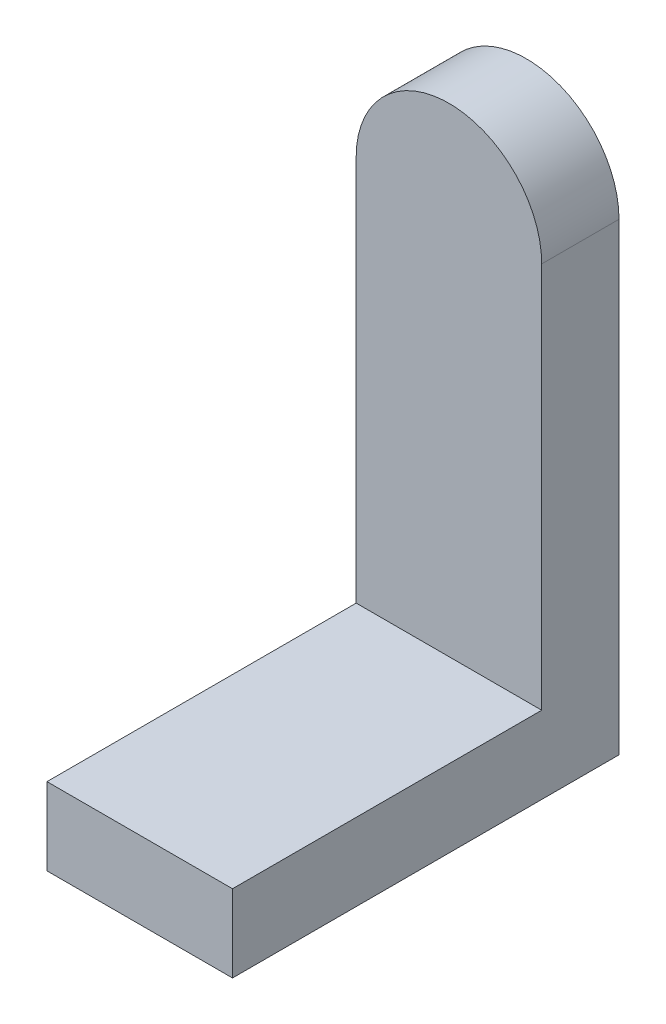
ISO-10303-21;
HEADER;
FILE_DESCRIPTION(('STEP AP214'),'2;1');
FILE_NAME('part.step','',(''),(''),'','','');
FILE_SCHEMA(('AUTOMOTIVE_DESIGN { 1 0 10303 214 1 1 1 1 }'));
ENDSEC;
DATA;
#1=APPLICATION_CONTEXT('core data for automotive mechanical design processes');
#2=APPLICATION_PROTOCOL_DEFINITION('international standard','automotive_design',2000,#1);
#3=PRODUCT_CONTEXT('',#1,'mechanical');
#4=PRODUCT('Part','Part','',(#3));
#5=PRODUCT_RELATED_PRODUCT_CATEGORY('part','',(#4));
#6=PRODUCT_DEFINITION_FORMATION('','',#4);
#7=PRODUCT_DEFINITION_CONTEXT('part definition',#1,'design');
#8=PRODUCT_DEFINITION('design','',#6,#7);
#9=PRODUCT_DEFINITION_SHAPE('','',#8);
#10=(LENGTH_UNIT() NAMED_UNIT(*) SI_UNIT(.MILLI.,.METRE.));
#11=(NAMED_UNIT(*) PLANE_ANGLE_UNIT() SI_UNIT($,.RADIAN.));
#12=(NAMED_UNIT(*) SI_UNIT($,.STERADIAN.) SOLID_ANGLE_UNIT());
#13=UNCERTAINTY_MEASURE_WITH_UNIT(LENGTH_MEASURE(1.E-05),#10,'distance_accuracy_value','');
#14=(GEOMETRIC_REPRESENTATION_CONTEXT(3) GLOBAL_UNCERTAINTY_ASSIGNED_CONTEXT((#13)) GLOBAL_UNIT_ASSIGNED_CONTEXT((#10,
#11,#12)) REPRESENTATION_CONTEXT('',''));
#15=CARTESIAN_POINT('',(0.,0.,0.));
#16=DIRECTION('',(0.,0.,1.));
#17=DIRECTION('',(1.,0.,0.));
#18=AXIS2_PLACEMENT_3D('',#15,#16,#17);
#19=CARTESIAN_POINT('',(0.,0.,5.));
#20=DIRECTION('',(0.,0.,1.));
#21=DIRECTION('',(1.,0.,0.));
#22=AXIS2_PLACEMENT_3D('',#19,#20,#21);
#23=PLANE('',#22);
#24=DIRECTION('',(0.,-1.,0.));
#25=VECTOR('',#24,1.);
#26=CARTESIAN_POINT('',(-6.,0.,5.));
#27=LINE('',#26,#25);
#28=CARTESIAN_POINT('',(-6.,15.,5.));
#29=VERTEX_POINT('',#28);
#30=CARTESIAN_POINT('',(-6.,-10.,5.));
#31=VERTEX_POINT('',#30);
#32=EDGE_CURVE('E97',#29,#31,#27,.T.);
#33=ORIENTED_EDGE('',*,*,#32,.T.);
#34=DIRECTION('',(1.,0.,0.));
#35=VECTOR('',#34,1.);
#36=CARTESIAN_POINT('',(-6.,-10.,5.));
#37=LINE('',#36,#35);
#38=CARTESIAN_POINT('',(6.,-10.,5.));
#39=VERTEX_POINT('',#38);
#40=EDGE_CURVE('E124',#31,#39,#37,.T.);
#41=ORIENTED_EDGE('',*,*,#40,.T.);
#42=DIRECTION('',(0.,-1.,0.));
#43=VECTOR('',#42,1.);
#44=CARTESIAN_POINT('',(6.,0.,5.));
#45=LINE('',#44,#43);
#46=CARTESIAN_POINT('',(6.,15.,5.));
#47=VERTEX_POINT('',#46);
#48=EDGE_CURVE('E81',#47,#39,#45,.T.);
#49=ORIENTED_EDGE('',*,*,#48,.F.);
#50=CARTESIAN_POINT('',(0.,15.,5.));
#51=DIRECTION('',(0.,0.,1.));
#52=DIRECTION('',(1.,0.,0.));
#53=AXIS2_PLACEMENT_3D('',#50,#51,#52);
#54=CIRCLE('',#53,6.);
#55=EDGE_CURVE('E78',#47,#29,#54,.T.);
#56=ORIENTED_EDGE('',*,*,#55,.T.);
#57=EDGE_LOOP('',(#33,#41,#49,#56));
#58=FACE_BOUND('',#57,.T.);
#59=ADVANCED_FACE('F32',(#58),#23,.T.);
#60=CARTESIAN_POINT('',(0.,15.,5.));
#61=DIRECTION('',(0.,0.,-1.));
#62=DIRECTION('',(-1.,0.,0.));
#63=AXIS2_PLACEMENT_3D('',#60,#61,#62);
#64=CYLINDRICAL_SURFACE('',#63,6.);
#65=CARTESIAN_POINT('',(0.,15.,0.));
#66=DIRECTION('',(0.,0.,1.));
#67=DIRECTION('',(1.,0.,0.));
#68=AXIS2_PLACEMENT_3D('',#65,#66,#67);
#69=CIRCLE('',#68,6.);
#70=CARTESIAN_POINT('',(6.,15.,0.));
#71=VERTEX_POINT('',#70);
#72=CARTESIAN_POINT('',(-6.,15.,0.));
#73=VERTEX_POINT('',#72);
#74=EDGE_CURVE('E76',#71,#73,#69,.T.);
#75=ORIENTED_EDGE('',*,*,#74,.T.);
#76=DIRECTION('',(0.,0.,-1.));
#77=VECTOR('',#76,1.);
#78=CARTESIAN_POINT('',(-6.,15.,5.));
#79=LINE('',#78,#77);
#80=EDGE_CURVE('E11',#29,#73,#79,.T.);
#81=ORIENTED_EDGE('',*,*,#80,.F.);
#82=ORIENTED_EDGE('',*,*,#55,.F.);
#83=DIRECTION('',(0.,0.,-1.));
#84=VECTOR('',#83,1.);
#85=CARTESIAN_POINT('',(6.,15.,5.));
#86=LINE('',#85,#84);
#87=EDGE_CURVE('E56',#47,#71,#86,.T.);
#88=ORIENTED_EDGE('',*,*,#87,.T.);
#89=EDGE_LOOP('',(#75,#81,#82,#88));
#90=FACE_BOUND('',#89,.T.);
#91=ADVANCED_FACE('F34',(#90),#64,.T.);
#92=CARTESIAN_POINT('',(-6.,0.,5.));
#93=DIRECTION('',(1.,0.,0.));
#94=DIRECTION('',(0.,1.,0.));
#95=AXIS2_PLACEMENT_3D('',#92,#93,#94);
#96=PLANE('',#95);
#97=DIRECTION('',(0.,-1.,0.));
#98=VECTOR('',#97,1.);
#99=CARTESIAN_POINT('',(-6.,0.,0.));
#100=LINE('',#99,#98);
#101=CARTESIAN_POINT('',(-6.,-15.,0.));
#102=VERTEX_POINT('',#101);
#103=EDGE_CURVE('E88',#73,#102,#100,.T.);
#104=ORIENTED_EDGE('',*,*,#103,.T.);
#105=DIRECTION('',(0.,0.,-1.));
#106=VECTOR('',#105,1.);
#107=CARTESIAN_POINT('',(-6.,-15.,5.));
#108=LINE('',#107,#106);
#109=CARTESIAN_POINT('',(-6.,-15.,25.));
#110=VERTEX_POINT('',#109);
#111=EDGE_CURVE('E40',#110,#102,#108,.T.);
#112=ORIENTED_EDGE('',*,*,#111,.F.);
#113=DIRECTION('',(0.,-1.,0.));
#114=VECTOR('',#113,1.);
#115=CARTESIAN_POINT('',(-6.,-15.,25.));
#116=LINE('',#115,#114);
#117=CARTESIAN_POINT('',(-6.,-10.,25.));
#118=VERTEX_POINT('',#117);
#119=EDGE_CURVE('E114',#118,#110,#116,.T.);
#120=ORIENTED_EDGE('',*,*,#119,.F.);
#121=DIRECTION('',(0.,0.,1.));
#122=VECTOR('',#121,1.);
#123=CARTESIAN_POINT('',(-6.,-10.,5.));
#124=LINE('',#123,#122);
#125=EDGE_CURVE('E126',#31,#118,#124,.T.);
#126=ORIENTED_EDGE('',*,*,#125,.F.);
#127=ORIENTED_EDGE('',*,*,#32,.F.);
#128=ORIENTED_EDGE('',*,*,#80,.T.);
#129=EDGE_LOOP('',(#104,#112,#120,#126,#127,#128));
#130=FACE_BOUND('',#129,.T.);
#131=ADVANCED_FACE('F111',(#130),#96,.F.);
#132=CARTESIAN_POINT('',(0.,-15.,5.));
#133=DIRECTION('',(0.,1.,0.));
#134=DIRECTION('',(-1.,0.,0.));
#135=AXIS2_PLACEMENT_3D('',#132,#133,#134);
#136=PLANE('',#135);
#137=DIRECTION('',(1.,0.,0.));
#138=VECTOR('',#137,1.);
#139=CARTESIAN_POINT('',(0.,-15.,0.));
#140=LINE('',#139,#138);
#141=CARTESIAN_POINT('',(6.,-15.,0.));
#142=VERTEX_POINT('',#141);
#143=EDGE_CURVE('E95',#102,#142,#140,.T.);
#144=ORIENTED_EDGE('',*,*,#143,.T.);
#145=DIRECTION('',(0.,0.,-1.));
#146=VECTOR('',#145,1.);
#147=CARTESIAN_POINT('',(6.,-15.,5.));
#148=LINE('',#147,#146);
#149=CARTESIAN_POINT('',(6.,-15.,25.));
#150=VERTEX_POINT('',#149);
#151=EDGE_CURVE('E80',#150,#142,#148,.T.);
#152=ORIENTED_EDGE('',*,*,#151,.F.);
#153=DIRECTION('',(1.,0.,0.));
#154=VECTOR('',#153,1.);
#155=CARTESIAN_POINT('',(-6.,-15.,25.));
#156=LINE('',#155,#154);
#157=EDGE_CURVE('E89',#110,#150,#156,.T.);
#158=ORIENTED_EDGE('',*,*,#157,.F.);
#159=ORIENTED_EDGE('',*,*,#111,.T.);
#160=EDGE_LOOP('',(#144,#152,#158,#159));
#161=FACE_BOUND('',#160,.T.);
#162=ADVANCED_FACE('F106',(#161),#136,.F.);
#163=CARTESIAN_POINT('',(6.,0.,5.));
#164=DIRECTION('',(1.,0.,0.));
#165=DIRECTION('',(0.,1.,0.));
#166=AXIS2_PLACEMENT_3D('',#163,#164,#165);
#167=PLANE('',#166);
#168=DIRECTION('',(0.,-1.,0.));
#169=VECTOR('',#168,1.);
#170=CARTESIAN_POINT('',(6.,0.,0.));
#171=LINE('',#170,#169);
#172=EDGE_CURVE('E87',#71,#142,#171,.T.);
#173=ORIENTED_EDGE('',*,*,#172,.F.);
#174=ORIENTED_EDGE('',*,*,#87,.F.);
#175=ORIENTED_EDGE('',*,*,#48,.T.);
#176=DIRECTION('',(0.,0.,1.));
#177=VECTOR('',#176,1.);
#178=CARTESIAN_POINT('',(6.,-10.,5.));
#179=LINE('',#178,#177);
#180=CARTESIAN_POINT('',(6.,-10.,25.));
#181=VERTEX_POINT('',#180);
#182=EDGE_CURVE('E47',#39,#181,#179,.T.);
#183=ORIENTED_EDGE('',*,*,#182,.T.);
#184=DIRECTION('',(0.,-1.,0.));
#185=VECTOR('',#184,1.);
#186=CARTESIAN_POINT('',(6.,-15.,25.));
#187=LINE('',#186,#185);
#188=EDGE_CURVE('E131',#181,#150,#187,.T.);
#189=ORIENTED_EDGE('',*,*,#188,.T.);
#190=ORIENTED_EDGE('',*,*,#151,.T.);
#191=EDGE_LOOP('',(#173,#174,#175,#183,#189,#190));
#192=FACE_BOUND('',#191,.T.);
#193=ADVANCED_FACE('F91',(#192),#167,.T.);
#194=CARTESIAN_POINT('',(0.,0.,0.));
#195=DIRECTION('',(0.,0.,1.));
#196=DIRECTION('',(1.,0.,0.));
#197=AXIS2_PLACEMENT_3D('',#194,#195,#196);
#198=PLANE('',#197);
#199=ORIENTED_EDGE('',*,*,#74,.F.);
#200=ORIENTED_EDGE('',*,*,#172,.T.);
#201=ORIENTED_EDGE('',*,*,#143,.F.);
#202=ORIENTED_EDGE('',*,*,#103,.F.);
#203=EDGE_LOOP('',(#199,#200,#201,#202));
#204=FACE_BOUND('',#203,.T.);
#205=ADVANCED_FACE('F85',(#204),#198,.F.);
#206=CARTESIAN_POINT('',(-6.,-15.,25.));
#207=DIRECTION('',(0.,0.,1.));
#208=DIRECTION('',(1.,0.,0.));
#209=AXIS2_PLACEMENT_3D('',#206,#207,#208);
#210=PLANE('',#209);
#211=ORIENTED_EDGE('',*,*,#188,.F.);
#212=DIRECTION('',(1.,0.,0.));
#213=VECTOR('',#212,1.);
#214=CARTESIAN_POINT('',(-6.,-10.,25.));
#215=LINE('',#214,#213);
#216=EDGE_CURVE('E129',#118,#181,#215,.T.);
#217=ORIENTED_EDGE('',*,*,#216,.F.);
#218=ORIENTED_EDGE('',*,*,#119,.T.);
#219=ORIENTED_EDGE('',*,*,#157,.T.);
#220=EDGE_LOOP('',(#211,#217,#218,#219));
#221=FACE_BOUND('',#220,.T.);
#222=ADVANCED_FACE('F142',(#221),#210,.T.);
#223=CARTESIAN_POINT('',(-6.,-10.,5.));
#224=DIRECTION('',(0.,1.,0.));
#225=DIRECTION('',(0.,0.,1.));
#226=AXIS2_PLACEMENT_3D('',#223,#224,#225);
#227=PLANE('',#226);
#228=ORIENTED_EDGE('',*,*,#182,.F.);
#229=ORIENTED_EDGE('',*,*,#40,.F.);
#230=ORIENTED_EDGE('',*,*,#125,.T.);
#231=ORIENTED_EDGE('',*,*,#216,.T.);
#232=EDGE_LOOP('',(#228,#229,#230,#231));
#233=FACE_BOUND('',#232,.T.);
#234=ADVANCED_FACE('F125',(#233),#227,.T.);
#235=CLOSED_SHELL('',(#59,#91,#131,#162,#193,#205,#222,#234));
#236=MANIFOLD_SOLID_BREP('B2',#235);
#237=ADVANCED_BREP_SHAPE_REPRESENTATION('',(#18,#236),#14);
#238=SHAPE_DEFINITION_REPRESENTATION(#9,#237);
ENDSEC;
END-ISO-10303-21;
